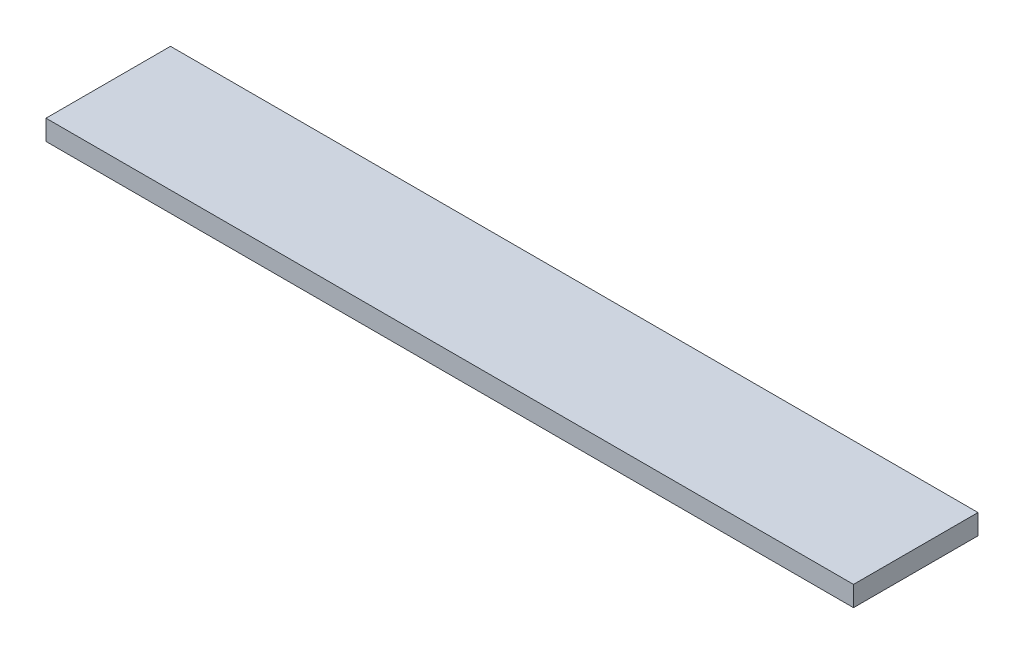
ISO-10303-21;
HEADER;
FILE_DESCRIPTION(('STEP AP214'),'2;1');
FILE_NAME('part.step','',(''),(''),'','','');
FILE_SCHEMA(('AUTOMOTIVE_DESIGN { 1 0 10303 214 1 1 1 1 }'));
ENDSEC;
DATA;
#1=APPLICATION_CONTEXT('core data for automotive mechanical design processes');
#2=APPLICATION_PROTOCOL_DEFINITION('international standard','automotive_design',2000,#1);
#3=PRODUCT_CONTEXT('',#1,'mechanical');
#4=PRODUCT('Part','Part','',(#3));
#5=PRODUCT_RELATED_PRODUCT_CATEGORY('part','',(#4));
#6=PRODUCT_DEFINITION_FORMATION('','',#4);
#7=PRODUCT_DEFINITION_CONTEXT('part definition',#1,'design');
#8=PRODUCT_DEFINITION('design','',#6,#7);
#9=PRODUCT_DEFINITION_SHAPE('','',#8);
#10=(LENGTH_UNIT() NAMED_UNIT(*) SI_UNIT(.MILLI.,.METRE.));
#11=(NAMED_UNIT(*) PLANE_ANGLE_UNIT() SI_UNIT($,.RADIAN.));
#12=(NAMED_UNIT(*) SI_UNIT($,.STERADIAN.) SOLID_ANGLE_UNIT());
#13=UNCERTAINTY_MEASURE_WITH_UNIT(LENGTH_MEASURE(1.E-05),#10,'distance_accuracy_value','');
#14=(GEOMETRIC_REPRESENTATION_CONTEXT(3) GLOBAL_UNCERTAINTY_ASSIGNED_CONTEXT((#13)) GLOBAL_UNIT_ASSIGNED_CONTEXT((#10,
#11,#12)) REPRESENTATION_CONTEXT('',''));
#15=CARTESIAN_POINT('',(0.,0.,0.));
#16=DIRECTION('',(0.,0.,1.));
#17=DIRECTION('',(1.,0.,0.));
#18=AXIS2_PLACEMENT_3D('',#15,#16,#17);
#19=CARTESIAN_POINT('',(-6705.6,38.1000000000009,-7711.43999999999));
#20=DIRECTION('',(1.,0.,0.));
#21=DIRECTION('',(0.,0.,-1.));
#22=AXIS2_PLACEMENT_3D('',#19,#20,#21);
#23=PLANE('',#22);
#24=DIRECTION('',(0.,0.,1.));
#25=VECTOR('',#24,1.);
#26=CARTESIAN_POINT('',(-6705.6,8.88178419700125E-13,-7711.43999999999));
#27=LINE('',#26,#25);
#28=CARTESIAN_POINT('',(-6705.6,8.88178419700125E-13,-7711.43999999999));
#29=VERTEX_POINT('',#28);
#30=CARTESIAN_POINT('',(-6705.6,8.88178419700125E-13,-7476.48999999999));
#31=VERTEX_POINT('',#30);
#32=EDGE_CURVE('E95',#29,#31,#27,.T.);
#33=ORIENTED_EDGE('',*,*,#32,.T.);
#34=DIRECTION('',(0.,-1.,0.));
#35=VECTOR('',#34,1.);
#36=CARTESIAN_POINT('',(-6705.6,38.1000000000009,-7476.48999999999));
#37=LINE('',#36,#35);
#38=CARTESIAN_POINT('',(-6705.6,38.1000000000009,-7476.48999999999));
#39=VERTEX_POINT('',#38);
#40=EDGE_CURVE('E11',#39,#31,#37,.T.);
#41=ORIENTED_EDGE('',*,*,#40,.F.);
#42=DIRECTION('',(0.,0.,1.));
#43=VECTOR('',#42,1.);
#44=CARTESIAN_POINT('',(-6705.6,38.1000000000009,-7711.43999999999));
#45=LINE('',#44,#43);
#46=CARTESIAN_POINT('',(-6705.6,38.1000000000009,-7711.43999999999));
#47=VERTEX_POINT('',#46);
#48=EDGE_CURVE('E81',#47,#39,#45,.T.);
#49=ORIENTED_EDGE('',*,*,#48,.F.);
#50=DIRECTION('',(0.,-1.,0.));
#51=VECTOR('',#50,1.);
#52=CARTESIAN_POINT('',(-6705.6,38.1000000000009,-7711.43999999999));
#53=LINE('',#52,#51);
#54=EDGE_CURVE('E48',#47,#29,#53,.T.);
#55=ORIENTED_EDGE('',*,*,#54,.T.);
#56=EDGE_LOOP('',(#33,#41,#49,#55));
#57=FACE_BOUND('',#56,.T.);
#58=ADVANCED_FACE('F32',(#57),#23,.F.);
#59=CARTESIAN_POINT('',(-6705.6,38.1000000000009,-7476.48999999999));
#60=DIRECTION('',(0.,0.,-1.));
#61=DIRECTION('',(-1.,0.,0.));
#62=AXIS2_PLACEMENT_3D('',#59,#60,#61);
#63=PLANE('',#62);
#64=DIRECTION('',(1.,0.,0.));
#65=VECTOR('',#64,1.);
#66=CARTESIAN_POINT('',(-6705.6,8.88178419700125E-13,-7476.48999999999));
#67=LINE('',#66,#65);
#68=CARTESIAN_POINT('',(-5181.6,8.88178419700125E-13,-7476.48999999999));
#69=VERTEX_POINT('',#68);
#70=EDGE_CURVE('E86',#31,#69,#67,.T.);
#71=ORIENTED_EDGE('',*,*,#70,.T.);
#72=DIRECTION('',(0.,-1.,0.));
#73=VECTOR('',#72,1.);
#74=CARTESIAN_POINT('',(-5181.6,38.1000000000009,-7476.48999999999));
#75=LINE('',#74,#73);
#76=CARTESIAN_POINT('',(-5181.6,38.1000000000009,-7476.48999999999));
#77=VERTEX_POINT('',#76);
#78=EDGE_CURVE('E40',#77,#69,#75,.T.);
#79=ORIENTED_EDGE('',*,*,#78,.F.);
#80=DIRECTION('',(1.,0.,0.));
#81=VECTOR('',#80,1.);
#82=CARTESIAN_POINT('',(-6705.6,38.1000000000009,-7476.48999999999));
#83=LINE('',#82,#81);
#84=EDGE_CURVE('E73',#39,#77,#83,.T.);
#85=ORIENTED_EDGE('',*,*,#84,.F.);
#86=ORIENTED_EDGE('',*,*,#40,.T.);
#87=EDGE_LOOP('',(#71,#79,#85,#86));
#88=FACE_BOUND('',#87,.T.);
#89=ADVANCED_FACE('F85',(#88),#63,.F.);
#90=CARTESIAN_POINT('',(-5181.6,38.1000000000009,-7711.43999999999));
#91=DIRECTION('',(1.,0.,0.));
#92=DIRECTION('',(0.,0.,-1.));
#93=AXIS2_PLACEMENT_3D('',#90,#91,#92);
#94=PLANE('',#93);
#95=DIRECTION('',(0.,0.,1.));
#96=VECTOR('',#95,1.);
#97=CARTESIAN_POINT('',(-5181.6,8.88178419700125E-13,-7711.43999999999));
#98=LINE('',#97,#96);
#99=CARTESIAN_POINT('',(-5181.6,8.88178419700125E-13,-7711.43999999999));
#100=VERTEX_POINT('',#99);
#101=EDGE_CURVE('E98',#100,#69,#98,.T.);
#102=ORIENTED_EDGE('',*,*,#101,.F.);
#103=DIRECTION('',(0.,-1.,0.));
#104=VECTOR('',#103,1.);
#105=CARTESIAN_POINT('',(-5181.6,38.1000000000009,-7711.43999999999));
#106=LINE('',#105,#104);
#107=CARTESIAN_POINT('',(-5181.6,38.1000000000009,-7711.43999999999));
#108=VERTEX_POINT('',#107);
#109=EDGE_CURVE('E62',#108,#100,#106,.T.);
#110=ORIENTED_EDGE('',*,*,#109,.F.);
#111=DIRECTION('',(0.,0.,1.));
#112=VECTOR('',#111,1.);
#113=CARTESIAN_POINT('',(-5181.6,38.1000000000009,-7711.43999999999));
#114=LINE('',#113,#112);
#115=EDGE_CURVE('E80',#108,#77,#114,.T.);
#116=ORIENTED_EDGE('',*,*,#115,.T.);
#117=ORIENTED_EDGE('',*,*,#78,.T.);
#118=EDGE_LOOP('',(#102,#110,#116,#117));
#119=FACE_BOUND('',#118,.T.);
#120=ADVANCED_FACE('F89',(#119),#94,.T.);
#121=CARTESIAN_POINT('',(-6705.6,38.1000000000009,-7711.43999999999));
#122=DIRECTION('',(0.,0.,-1.));
#123=DIRECTION('',(-1.,0.,0.));
#124=AXIS2_PLACEMENT_3D('',#121,#122,#123);
#125=PLANE('',#124);
#126=DIRECTION('',(1.,0.,0.));
#127=VECTOR('',#126,1.);
#128=CARTESIAN_POINT('',(-6705.6,8.88178419700125E-13,-7711.43999999999));
#129=LINE('',#128,#127);
#130=EDGE_CURVE('E100',#29,#100,#129,.T.);
#131=ORIENTED_EDGE('',*,*,#130,.F.);
#132=ORIENTED_EDGE('',*,*,#54,.F.);
#133=DIRECTION('',(1.,0.,0.));
#134=VECTOR('',#133,1.);
#135=CARTESIAN_POINT('',(-6705.6,38.1000000000009,-7711.43999999999));
#136=LINE('',#135,#134);
#137=EDGE_CURVE('E90',#47,#108,#136,.T.);
#138=ORIENTED_EDGE('',*,*,#137,.T.);
#139=ORIENTED_EDGE('',*,*,#109,.T.);
#140=EDGE_LOOP('',(#131,#132,#138,#139));
#141=FACE_BOUND('',#140,.T.);
#142=ADVANCED_FACE('F106',(#141),#125,.T.);
#143=CARTESIAN_POINT('',(0.,38.1,0.));
#144=DIRECTION('',(0.,1.,0.));
#145=DIRECTION('',(0.,0.,1.));
#146=AXIS2_PLACEMENT_3D('',#143,#144,#145);
#147=PLANE('',#146);
#148=ORIENTED_EDGE('',*,*,#48,.T.);
#149=ORIENTED_EDGE('',*,*,#84,.T.);
#150=ORIENTED_EDGE('',*,*,#115,.F.);
#151=ORIENTED_EDGE('',*,*,#137,.F.);
#152=EDGE_LOOP('',(#148,#149,#150,#151));
#153=FACE_BOUND('',#152,.T.);
#154=ADVANCED_FACE('F77',(#153),#147,.T.);
#155=CARTESIAN_POINT('',(0.,0.,0.));
#156=DIRECTION('',(0.,1.,0.));
#157=DIRECTION('',(0.,0.,1.));
#158=AXIS2_PLACEMENT_3D('',#155,#156,#157);
#159=PLANE('',#158);
#160=ORIENTED_EDGE('',*,*,#32,.F.);
#161=ORIENTED_EDGE('',*,*,#130,.T.);
#162=ORIENTED_EDGE('',*,*,#101,.T.);
#163=ORIENTED_EDGE('',*,*,#70,.F.);
#164=EDGE_LOOP('',(#160,#161,#162,#163));
#165=FACE_BOUND('',#164,.T.);
#166=ADVANCED_FACE('F105',(#165),#159,.F.);
#167=CLOSED_SHELL('',(#58,#89,#120,#142,#154,#166));
#168=MANIFOLD_SOLID_BREP('B2',#167);
#169=ADVANCED_BREP_SHAPE_REPRESENTATION('',(#18,#168),#14);
#170=SHAPE_DEFINITION_REPRESENTATION(#9,#169);
ENDSEC;
END-ISO-10303-21;
